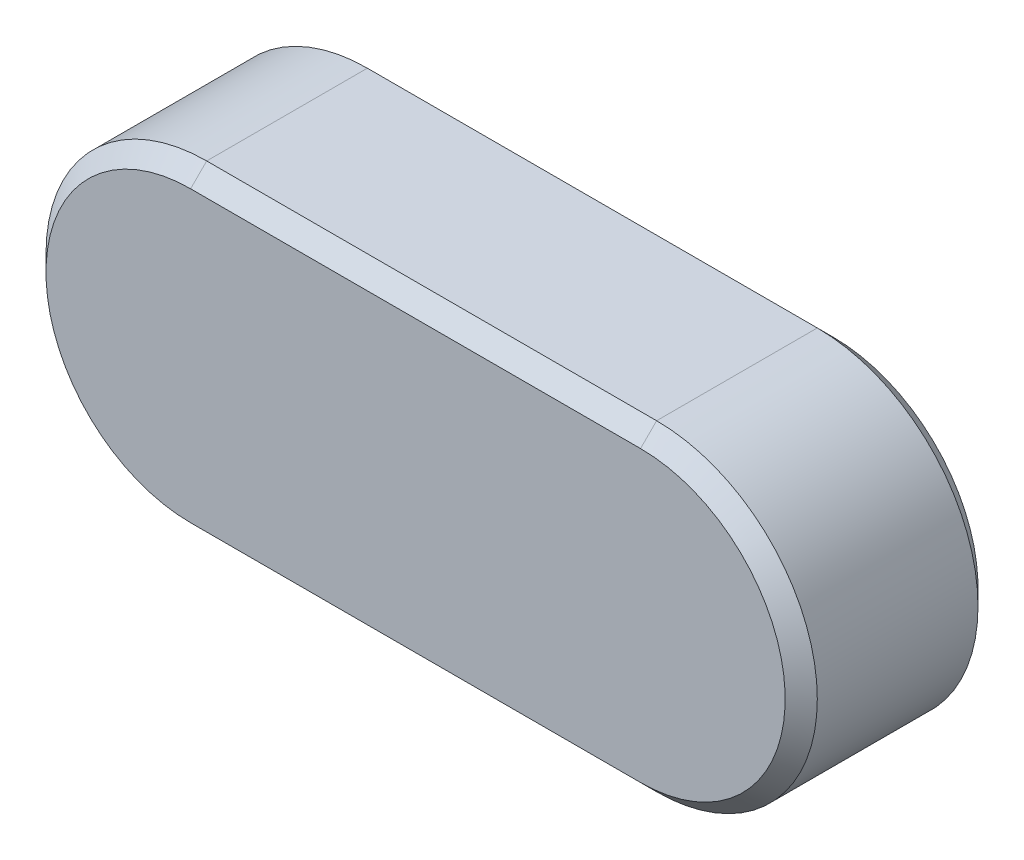
ISO-10303-21;
HEADER;
FILE_DESCRIPTION(('STEP AP214'),'2;1');
FILE_NAME('part.step','',(''),(''),'','','');
FILE_SCHEMA(('AUTOMOTIVE_DESIGN { 1 0 10303 214 1 1 1 1 }'));
ENDSEC;
DATA;
#1=APPLICATION_CONTEXT('core data for automotive mechanical design processes');
#2=APPLICATION_PROTOCOL_DEFINITION('international standard','automotive_design',2000,#1);
#3=PRODUCT_CONTEXT('',#1,'mechanical');
#4=PRODUCT('Part','Part','',(#3));
#5=PRODUCT_RELATED_PRODUCT_CATEGORY('part','',(#4));
#6=PRODUCT_DEFINITION_FORMATION('','',#4);
#7=PRODUCT_DEFINITION_CONTEXT('part definition',#1,'design');
#8=PRODUCT_DEFINITION('design','',#6,#7);
#9=PRODUCT_DEFINITION_SHAPE('','',#8);
#10=(LENGTH_UNIT() NAMED_UNIT(*) SI_UNIT(.MILLI.,.METRE.));
#11=(NAMED_UNIT(*) PLANE_ANGLE_UNIT() SI_UNIT($,.RADIAN.));
#12=(NAMED_UNIT(*) SI_UNIT($,.STERADIAN.) SOLID_ANGLE_UNIT());
#13=UNCERTAINTY_MEASURE_WITH_UNIT(LENGTH_MEASURE(1.E-05),#10,'distance_accuracy_value','');
#14=(GEOMETRIC_REPRESENTATION_CONTEXT(3) GLOBAL_UNCERTAINTY_ASSIGNED_CONTEXT((#13)) GLOBAL_UNIT_ASSIGNED_CONTEXT((#10,
#11,#12)) REPRESENTATION_CONTEXT('',''));
#15=CARTESIAN_POINT('',(0.,0.,0.));
#16=DIRECTION('',(0.,0.,1.));
#17=DIRECTION('',(1.,0.,0.));
#18=AXIS2_PLACEMENT_3D('',#15,#16,#17);
#19=CARTESIAN_POINT('',(0.,0.,3.));
#20=DIRECTION('',(0.,0.,-1.));
#21=DIRECTION('',(-1.,0.,0.));
#22=AXIS2_PLACEMENT_3D('',#19,#20,#21);
#23=CYLINDRICAL_SURFACE('',#22,2.5);
#24=DIRECTION('',(0.,0.,-1.));
#25=VECTOR('',#24,1.);
#26=CARTESIAN_POINT('',(0.,-2.5,3.));
#27=LINE('',#26,#25);
#28=CARTESIAN_POINT('',(0.,-2.5,2.75));
#29=VERTEX_POINT('',#28);
#30=CARTESIAN_POINT('',(0.,-2.5,0.250000000000002));
#31=VERTEX_POINT('',#30);
#32=EDGE_CURVE('E156',#29,#31,#27,.T.);
#33=ORIENTED_EDGE('',*,*,#32,.T.);
#34=CARTESIAN_POINT('',(0.,0.,0.250000000000002));
#35=DIRECTION('',(0.,0.,1.));
#36=DIRECTION('',(1.,0.,0.));
#37=AXIS2_PLACEMENT_3D('',#34,#35,#36);
#38=CIRCLE('',#37,2.5);
#39=CARTESIAN_POINT('',(0.,2.5,0.250000000000002));
#40=VERTEX_POINT('',#39);
#41=EDGE_CURVE('E180',#31,#40,#38,.T.);
#42=ORIENTED_EDGE('',*,*,#41,.T.);
#43=DIRECTION('',(0.,0.,-1.));
#44=VECTOR('',#43,1.);
#45=CARTESIAN_POINT('',(0.,2.5,3.));
#46=LINE('',#45,#44);
#47=CARTESIAN_POINT('',(0.,2.5,2.75));
#48=VERTEX_POINT('',#47);
#49=EDGE_CURVE('E125',#48,#40,#46,.T.);
#50=ORIENTED_EDGE('',*,*,#49,.F.);
#51=CARTESIAN_POINT('',(0.,0.,2.75));
#52=DIRECTION('',(0.,0.,1.));
#53=DIRECTION('',(1.,0.,0.));
#54=AXIS2_PLACEMENT_3D('',#51,#52,#53);
#55=CIRCLE('',#54,2.5);
#56=EDGE_CURVE('E178',#48,#29,#55,.F.);
#57=ORIENTED_EDGE('',*,*,#56,.T.);
#58=EDGE_LOOP('',(#33,#42,#50,#57));
#59=FACE_BOUND('',#58,.T.);
#60=ADVANCED_FACE('F34',(#59),#23,.T.);
#61=CARTESIAN_POINT('',(0.,2.5,3.));
#62=DIRECTION('',(0.,-1.,0.));
#63=DIRECTION('',(1.,0.,0.));
#64=AXIS2_PLACEMENT_3D('',#61,#62,#63);
#65=PLANE('',#64);
#66=ORIENTED_EDGE('',*,*,#49,.T.);
#67=DIRECTION('',(-1.,0.,0.));
#68=VECTOR('',#67,1.);
#69=CARTESIAN_POINT('',(0.,2.5,0.250000000000002));
#70=LINE('',#69,#68);
#71=CARTESIAN_POINT('',(-7.,2.5,0.250000000000002));
#72=VERTEX_POINT('',#71);
#73=EDGE_CURVE('E124',#40,#72,#70,.T.);
#74=ORIENTED_EDGE('',*,*,#73,.T.);
#75=DIRECTION('',(0.,0.,-1.));
#76=VECTOR('',#75,1.);
#77=CARTESIAN_POINT('',(-7.,2.5,3.));
#78=LINE('',#77,#76);
#79=CARTESIAN_POINT('',(-7.,2.5,2.75));
#80=VERTEX_POINT('',#79);
#81=EDGE_CURVE('E107',#80,#72,#78,.T.);
#82=ORIENTED_EDGE('',*,*,#81,.F.);
#83=DIRECTION('',(1.,0.,0.));
#84=VECTOR('',#83,1.);
#85=CARTESIAN_POINT('',(0.,2.5,2.75));
#86=LINE('',#85,#84);
#87=EDGE_CURVE('E121',#80,#48,#86,.T.);
#88=ORIENTED_EDGE('',*,*,#87,.T.);
#89=EDGE_LOOP('',(#66,#74,#82,#88));
#90=FACE_BOUND('',#89,.T.);
#91=ADVANCED_FACE('F120',(#90),#65,.F.);
#92=CARTESIAN_POINT('',(-7.,0.,3.));
#93=DIRECTION('',(0.,0.,-1.));
#94=DIRECTION('',(-1.,0.,0.));
#95=AXIS2_PLACEMENT_3D('',#92,#93,#94);
#96=CYLINDRICAL_SURFACE('',#95,2.5);
#97=ORIENTED_EDGE('',*,*,#81,.T.);
#98=CARTESIAN_POINT('',(-7.,0.,0.250000000000002));
#99=DIRECTION('',(0.,0.,1.));
#100=DIRECTION('',(1.,0.,0.));
#101=AXIS2_PLACEMENT_3D('',#98,#99,#100);
#102=CIRCLE('',#101,2.5);
#103=CARTESIAN_POINT('',(-7.,-2.5,0.250000000000002));
#104=VERTEX_POINT('',#103);
#105=EDGE_CURVE('E113',#72,#104,#102,.T.);
#106=ORIENTED_EDGE('',*,*,#105,.T.);
#107=DIRECTION('',(0.,0.,-1.));
#108=VECTOR('',#107,1.);
#109=CARTESIAN_POINT('',(-7.,-2.5,3.));
#110=LINE('',#109,#108);
#111=CARTESIAN_POINT('',(-7.,-2.5,2.75));
#112=VERTEX_POINT('',#111);
#113=EDGE_CURVE('E109',#112,#104,#110,.T.);
#114=ORIENTED_EDGE('',*,*,#113,.F.);
#115=CARTESIAN_POINT('',(-7.,0.,2.75));
#116=DIRECTION('',(0.,0.,1.));
#117=DIRECTION('',(1.,0.,0.));
#118=AXIS2_PLACEMENT_3D('',#115,#116,#117);
#119=CIRCLE('',#118,2.5);
#120=EDGE_CURVE('E104',#112,#80,#119,.F.);
#121=ORIENTED_EDGE('',*,*,#120,.T.);
#122=EDGE_LOOP('',(#97,#106,#114,#121));
#123=FACE_BOUND('',#122,.T.);
#124=ADVANCED_FACE('F106',(#123),#96,.T.);
#125=CARTESIAN_POINT('',(-7.,-2.5,3.));
#126=DIRECTION('',(0.,1.,0.));
#127=DIRECTION('',(-1.,0.,0.));
#128=AXIS2_PLACEMENT_3D('',#125,#126,#127);
#129=PLANE('',#128);
#130=ORIENTED_EDGE('',*,*,#113,.T.);
#131=DIRECTION('',(1.,0.,0.));
#132=VECTOR('',#131,1.);
#133=CARTESIAN_POINT('',(-7.,-2.5,0.250000000000002));
#134=LINE('',#133,#132);
#135=EDGE_CURVE('E184',#104,#31,#134,.T.);
#136=ORIENTED_EDGE('',*,*,#135,.T.);
#137=ORIENTED_EDGE('',*,*,#32,.F.);
#138=DIRECTION('',(-1.,0.,0.));
#139=VECTOR('',#138,1.);
#140=CARTESIAN_POINT('',(-7.,-2.5,2.75));
#141=LINE('',#140,#139);
#142=EDGE_CURVE('E182',#29,#112,#141,.T.);
#143=ORIENTED_EDGE('',*,*,#142,.T.);
#144=EDGE_LOOP('',(#130,#136,#137,#143));
#145=FACE_BOUND('',#144,.T.);
#146=ADVANCED_FACE('F194',(#145),#129,.F.);
#147=CARTESIAN_POINT('',(0.,0.,3.));
#148=DIRECTION('',(0.,0.,1.));
#149=DIRECTION('',(1.,0.,0.));
#150=AXIS2_PLACEMENT_3D('',#147,#148,#149);
#151=PLANE('',#150);
#152=CARTESIAN_POINT('',(0.,0.,3.));
#153=DIRECTION('',(0.,0.,1.));
#154=DIRECTION('',(1.,0.,0.));
#155=AXIS2_PLACEMENT_3D('',#152,#153,#154);
#156=CIRCLE('',#155,2.25);
#157=CARTESIAN_POINT('',(0.,-2.25,3.));
#158=VERTEX_POINT('',#157);
#159=CARTESIAN_POINT('',(0.,2.25,3.));
#160=VERTEX_POINT('',#159);
#161=EDGE_CURVE('E58',#158,#160,#156,.T.);
#162=ORIENTED_EDGE('',*,*,#161,.T.);
#163=DIRECTION('',(-1.,0.,0.));
#164=VECTOR('',#163,1.);
#165=CARTESIAN_POINT('',(-7.,2.25,3.));
#166=LINE('',#165,#164);
#167=CARTESIAN_POINT('',(-7.,2.25,3.));
#168=VERTEX_POINT('',#167);
#169=EDGE_CURVE('E11',#160,#168,#166,.T.);
#170=ORIENTED_EDGE('',*,*,#169,.T.);
#171=CARTESIAN_POINT('',(-7.,0.,3.));
#172=DIRECTION('',(0.,0.,1.));
#173=DIRECTION('',(1.,0.,0.));
#174=AXIS2_PLACEMENT_3D('',#171,#172,#173);
#175=CIRCLE('',#174,2.25);
#176=CARTESIAN_POINT('',(-7.,-2.25,3.));
#177=VERTEX_POINT('',#176);
#178=EDGE_CURVE('E43',#168,#177,#175,.T.);
#179=ORIENTED_EDGE('',*,*,#178,.T.);
#180=DIRECTION('',(1.,0.,0.));
#181=VECTOR('',#180,1.);
#182=CARTESIAN_POINT('',(0.,-2.25,3.));
#183=LINE('',#182,#181);
#184=EDGE_CURVE('E186',#177,#158,#183,.T.);
#185=ORIENTED_EDGE('',*,*,#184,.T.);
#186=EDGE_LOOP('',(#162,#170,#179,#185));
#187=FACE_BOUND('',#186,.T.);
#188=ADVANCED_FACE('F189',(#187),#151,.T.);
#189=CARTESIAN_POINT('',(0.,0.,0.));
#190=DIRECTION('',(0.,0.,1.));
#191=DIRECTION('',(1.,0.,0.));
#192=AXIS2_PLACEMENT_3D('',#189,#190,#191);
#193=PLANE('',#192);
#194=CARTESIAN_POINT('',(-7.,0.,0.));
#195=DIRECTION('',(0.,0.,1.));
#196=DIRECTION('',(1.,0.,0.));
#197=AXIS2_PLACEMENT_3D('',#194,#195,#196);
#198=CIRCLE('',#197,2.25);
#199=CARTESIAN_POINT('',(-7.,-2.25,0.));
#200=VERTEX_POINT('',#199);
#201=CARTESIAN_POINT('',(-7.,2.25,0.));
#202=VERTEX_POINT('',#201);
#203=EDGE_CURVE('E173',#200,#202,#198,.F.);
#204=ORIENTED_EDGE('',*,*,#203,.T.);
#205=DIRECTION('',(1.,0.,0.));
#206=VECTOR('',#205,1.);
#207=CARTESIAN_POINT('',(0.,2.25,0.));
#208=LINE('',#207,#206);
#209=CARTESIAN_POINT('',(0.,2.25,0.));
#210=VERTEX_POINT('',#209);
#211=EDGE_CURVE('E114',#202,#210,#208,.T.);
#212=ORIENTED_EDGE('',*,*,#211,.T.);
#213=CARTESIAN_POINT('',(0.,0.,0.));
#214=DIRECTION('',(0.,0.,1.));
#215=DIRECTION('',(1.,0.,0.));
#216=AXIS2_PLACEMENT_3D('',#213,#214,#215);
#217=CIRCLE('',#216,2.25);
#218=CARTESIAN_POINT('',(0.,-2.25,0.));
#219=VERTEX_POINT('',#218);
#220=EDGE_CURVE('E171',#210,#219,#217,.F.);
#221=ORIENTED_EDGE('',*,*,#220,.T.);
#222=DIRECTION('',(-1.,0.,0.));
#223=VECTOR('',#222,1.);
#224=CARTESIAN_POINT('',(0.,-2.25,0.));
#225=LINE('',#224,#223);
#226=EDGE_CURVE('E169',#219,#200,#225,.T.);
#227=ORIENTED_EDGE('',*,*,#226,.T.);
#228=EDGE_LOOP('',(#204,#212,#221,#227));
#229=FACE_BOUND('',#228,.T.);
#230=ADVANCED_FACE('F221',(#229),#193,.F.);
#231=CARTESIAN_POINT('',(-7.,-2.5,0.250000000000002));
#232=DIRECTION('',(0.,0.707106781186547,0.707106781186547));
#233=DIRECTION('',(0.,-0.707106781186548,0.707106781186548));
#234=AXIS2_PLACEMENT_3D('',#231,#232,#233);
#235=PLANE('',#234);
#236=DIRECTION('',(0.,-0.707106781186547,0.707106781186547));
#237=VECTOR('',#236,1.);
#238=CARTESIAN_POINT('',(-7.,-2.25,0.));
#239=LINE('',#238,#237);
#240=EDGE_CURVE('E148',#200,#104,#239,.T.);
#241=ORIENTED_EDGE('',*,*,#240,.F.);
#242=ORIENTED_EDGE('',*,*,#226,.F.);
#243=DIRECTION('',(0.,0.707106781186547,-0.707106781186547));
#244=VECTOR('',#243,1.);
#245=CARTESIAN_POINT('',(0.,-2.5,0.250000000000002));
#246=LINE('',#245,#244);
#247=EDGE_CURVE('E136',#31,#219,#246,.T.);
#248=ORIENTED_EDGE('',*,*,#247,.F.);
#249=ORIENTED_EDGE('',*,*,#135,.F.);
#250=EDGE_LOOP('',(#241,#242,#248,#249));
#251=FACE_BOUND('',#250,.T.);
#252=ADVANCED_FACE('F197',(#251),#235,.F.);
#253=CARTESIAN_POINT('',(0.,0.,0.250000000000002));
#254=DIRECTION('',(0.,0.,1.));
#255=DIRECTION('',(1.,0.,0.));
#256=AXIS2_PLACEMENT_3D('',#253,#254,#255);
#257=CONICAL_SURFACE('',#256,2.5,0.785398163397448);
#258=ORIENTED_EDGE('',*,*,#247,.T.);
#259=ORIENTED_EDGE('',*,*,#220,.F.);
#260=DIRECTION('',(0.,-0.707106781186547,-0.707106781186547));
#261=VECTOR('',#260,1.);
#262=CARTESIAN_POINT('',(0.,2.5,0.250000000000002));
#263=LINE('',#262,#261);
#264=EDGE_CURVE('E142',#40,#210,#263,.T.);
#265=ORIENTED_EDGE('',*,*,#264,.F.);
#266=ORIENTED_EDGE('',*,*,#41,.F.);
#267=EDGE_LOOP('',(#258,#259,#265,#266));
#268=FACE_BOUND('',#267,.T.);
#269=ADVANCED_FACE('F200',(#268),#257,.T.);
#270=CARTESIAN_POINT('',(-7.,0.,0.250000000000002));
#271=DIRECTION('',(0.,0.,1.));
#272=DIRECTION('',(1.,0.,0.));
#273=AXIS2_PLACEMENT_3D('',#270,#271,#272);
#274=CONICAL_SURFACE('',#273,2.5,0.785398163397448);
#275=ORIENTED_EDGE('',*,*,#240,.T.);
#276=ORIENTED_EDGE('',*,*,#105,.F.);
#277=DIRECTION('',(0.,0.707106781186547,0.707106781186547));
#278=VECTOR('',#277,1.);
#279=CARTESIAN_POINT('',(-7.,2.25,0.));
#280=LINE('',#279,#278);
#281=EDGE_CURVE('E139',#202,#72,#280,.T.);
#282=ORIENTED_EDGE('',*,*,#281,.F.);
#283=ORIENTED_EDGE('',*,*,#203,.F.);
#284=EDGE_LOOP('',(#275,#276,#282,#283));
#285=FACE_BOUND('',#284,.T.);
#286=ADVANCED_FACE('F203',(#285),#274,.T.);
#287=CARTESIAN_POINT('',(0.,2.5,0.250000000000002));
#288=DIRECTION('',(0.,-0.707106781186547,0.707106781186547));
#289=DIRECTION('',(0.,-0.707106781186548,-0.707106781186548));
#290=AXIS2_PLACEMENT_3D('',#287,#288,#289);
#291=PLANE('',#290);
#292=ORIENTED_EDGE('',*,*,#264,.T.);
#293=ORIENTED_EDGE('',*,*,#211,.F.);
#294=ORIENTED_EDGE('',*,*,#281,.T.);
#295=ORIENTED_EDGE('',*,*,#73,.F.);
#296=EDGE_LOOP('',(#292,#293,#294,#295));
#297=FACE_BOUND('',#296,.T.);
#298=ADVANCED_FACE('F201',(#297),#291,.F.);
#299=CARTESIAN_POINT('',(0.,-2.25,3.));
#300=DIRECTION('',(0.,-0.707106781186547,0.707106781186547));
#301=DIRECTION('',(0.,-0.707106781186548,-0.707106781186548));
#302=AXIS2_PLACEMENT_3D('',#299,#300,#301);
#303=PLANE('',#302);
#304=DIRECTION('',(0.,0.707106781186547,0.707106781186547));
#305=VECTOR('',#304,1.);
#306=CARTESIAN_POINT('',(-7.,-2.5,2.75));
#307=LINE('',#306,#305);
#308=EDGE_CURVE('E133',#112,#177,#307,.T.);
#309=ORIENTED_EDGE('',*,*,#308,.F.);
#310=ORIENTED_EDGE('',*,*,#142,.F.);
#311=DIRECTION('',(0.,-0.707106781186547,-0.707106781186547));
#312=VECTOR('',#311,1.);
#313=CARTESIAN_POINT('',(0.,-2.25,3.));
#314=LINE('',#313,#312);
#315=EDGE_CURVE('E38',#158,#29,#314,.T.);
#316=ORIENTED_EDGE('',*,*,#315,.F.);
#317=ORIENTED_EDGE('',*,*,#184,.F.);
#318=EDGE_LOOP('',(#309,#310,#316,#317));
#319=FACE_BOUND('',#318,.T.);
#320=ADVANCED_FACE('F36',(#319),#303,.T.);
#321=CARTESIAN_POINT('',(0.,0.,3.));
#322=DIRECTION('',(0.,0.,-1.));
#323=DIRECTION('',(-1.,0.,0.));
#324=AXIS2_PLACEMENT_3D('',#321,#322,#323);
#325=CONICAL_SURFACE('',#324,2.25,0.785398163397448);
#326=ORIENTED_EDGE('',*,*,#315,.T.);
#327=ORIENTED_EDGE('',*,*,#56,.F.);
#328=DIRECTION('',(0.,0.707106781186547,-0.707106781186547));
#329=VECTOR('',#328,1.);
#330=CARTESIAN_POINT('',(0.,2.25,3.));
#331=LINE('',#330,#329);
#332=EDGE_CURVE('E128',#160,#48,#331,.T.);
#333=ORIENTED_EDGE('',*,*,#332,.F.);
#334=ORIENTED_EDGE('',*,*,#161,.F.);
#335=EDGE_LOOP('',(#326,#327,#333,#334));
#336=FACE_BOUND('',#335,.T.);
#337=ADVANCED_FACE('F192',(#336),#325,.T.);
#338=CARTESIAN_POINT('',(-7.,0.,3.));
#339=DIRECTION('',(0.,0.,-1.));
#340=DIRECTION('',(-1.,0.,0.));
#341=AXIS2_PLACEMENT_3D('',#338,#339,#340);
#342=CONICAL_SURFACE('',#341,2.25,0.785398163397448);
#343=ORIENTED_EDGE('',*,*,#308,.T.);
#344=ORIENTED_EDGE('',*,*,#178,.F.);
#345=DIRECTION('',(0.,-0.707106781186547,0.707106781186547));
#346=VECTOR('',#345,1.);
#347=CARTESIAN_POINT('',(-7.,2.5,2.75));
#348=LINE('',#347,#346);
#349=EDGE_CURVE('E51',#80,#168,#348,.T.);
#350=ORIENTED_EDGE('',*,*,#349,.F.);
#351=ORIENTED_EDGE('',*,*,#120,.F.);
#352=EDGE_LOOP('',(#343,#344,#350,#351));
#353=FACE_BOUND('',#352,.T.);
#354=ADVANCED_FACE('F131',(#353),#342,.T.);
#355=CARTESIAN_POINT('',(0.,2.25,3.));
#356=DIRECTION('',(0.,0.707106781186547,0.707106781186547));
#357=DIRECTION('',(0.,-0.707106781186548,0.707106781186548));
#358=AXIS2_PLACEMENT_3D('',#355,#356,#357);
#359=PLANE('',#358);
#360=ORIENTED_EDGE('',*,*,#332,.T.);
#361=ORIENTED_EDGE('',*,*,#87,.F.);
#362=ORIENTED_EDGE('',*,*,#349,.T.);
#363=ORIENTED_EDGE('',*,*,#169,.F.);
#364=EDGE_LOOP('',(#360,#361,#362,#363));
#365=FACE_BOUND('',#364,.T.);
#366=ADVANCED_FACE('F127',(#365),#359,.T.);
#367=CLOSED_SHELL('',(#60,#91,#124,#146,#188,#230,#252,#269,#286,#298,#320,#337,#354,#366));
#368=MANIFOLD_SOLID_BREP('B2',#367);
#369=ADVANCED_BREP_SHAPE_REPRESENTATION('',(#18,#368),#14);
#370=SHAPE_DEFINITION_REPRESENTATION(#9,#369);
ENDSEC;
END-ISO-10303-21;
